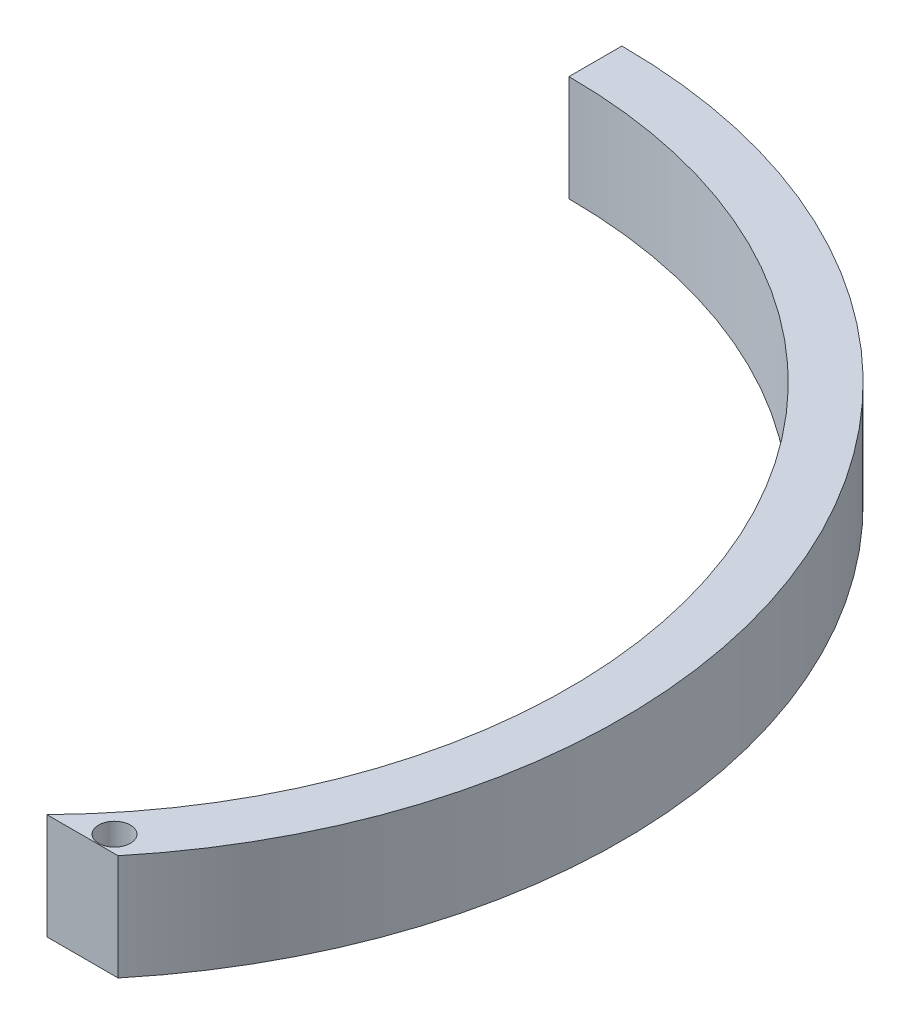
ISO-10303-21;
HEADER;
FILE_DESCRIPTION(('STEP AP214'),'2;1');
FILE_NAME('part.step','',(''),(''),'','','');
FILE_SCHEMA(('AUTOMOTIVE_DESIGN { 1 0 10303 214 1 1 1 1 }'));
ENDSEC;
DATA;
#1=APPLICATION_CONTEXT('core data for automotive mechanical design processes');
#2=APPLICATION_PROTOCOL_DEFINITION('international standard','automotive_design',2000,#1);
#3=PRODUCT_CONTEXT('',#1,'mechanical');
#4=PRODUCT('Part','Part','',(#3));
#5=PRODUCT_RELATED_PRODUCT_CATEGORY('part','',(#4));
#6=PRODUCT_DEFINITION_FORMATION('','',#4);
#7=PRODUCT_DEFINITION_CONTEXT('part definition',#1,'design');
#8=PRODUCT_DEFINITION('design','',#6,#7);
#9=PRODUCT_DEFINITION_SHAPE('','',#8);
#10=(LENGTH_UNIT() NAMED_UNIT(*) SI_UNIT(.MILLI.,.METRE.));
#11=(NAMED_UNIT(*) PLANE_ANGLE_UNIT() SI_UNIT($,.RADIAN.));
#12=(NAMED_UNIT(*) SI_UNIT($,.STERADIAN.) SOLID_ANGLE_UNIT());
#13=UNCERTAINTY_MEASURE_WITH_UNIT(LENGTH_MEASURE(1.E-05),#10,'distance_accuracy_value','');
#14=(GEOMETRIC_REPRESENTATION_CONTEXT(3) GLOBAL_UNCERTAINTY_ASSIGNED_CONTEXT((#13)) GLOBAL_UNIT_ASSIGNED_CONTEXT((#10,
#11,#12)) REPRESENTATION_CONTEXT('',''));
#15=CARTESIAN_POINT('',(0.,0.,0.));
#16=DIRECTION('',(0.,0.,1.));
#17=DIRECTION('',(1.,0.,0.));
#18=AXIS2_PLACEMENT_3D('',#15,#16,#17);
#19=CARTESIAN_POINT('',(0.,10.,0.));
#20=DIRECTION('',(0.,1.,0.));
#21=DIRECTION('',(0.,0.,1.));
#22=AXIS2_PLACEMENT_3D('',#19,#20,#21);
#23=PLANE('',#22);
#24=CARTESIAN_POINT('',(0.,10.,0.));
#25=DIRECTION('',(0.,-1.,0.));
#26=DIRECTION('',(0.,0.,1.));
#27=AXIS2_PLACEMENT_3D('',#24,#25,#26);
#28=CIRCLE('',#27,50.);
#29=CARTESIAN_POINT('',(0.,10.,-50.));
#30=VERTEX_POINT('',#29);
#31=CARTESIAN_POINT('',(35.7071421427143,10.,35.));
#32=VERTEX_POINT('',#31);
#33=EDGE_CURVE('E84',#30,#32,#28,.T.);
#34=ORIENTED_EDGE('',*,*,#33,.T.);
#35=DIRECTION('',(1.,0.,0.));
#36=VECTOR('',#35,1.);
#37=CARTESIAN_POINT('',(35.7071421427143,10.,35.));
#38=LINE('',#37,#36);
#39=CARTESIAN_POINT('',(42.4264068711929,10.,35.));
#40=VERTEX_POINT('',#39);
#41=EDGE_CURVE('E79',#32,#40,#38,.T.);
#42=ORIENTED_EDGE('',*,*,#41,.T.);
#43=CARTESIAN_POINT('',(0.,10.,0.));
#44=DIRECTION('',(0.,1.,0.));
#45=DIRECTION('',(0.,0.,1.));
#46=AXIS2_PLACEMENT_3D('',#43,#44,#45);
#47=CIRCLE('',#46,55.);
#48=CARTESIAN_POINT('',(0.,10.,-55.));
#49=VERTEX_POINT('',#48);
#50=EDGE_CURVE('E82',#40,#49,#47,.T.);
#51=ORIENTED_EDGE('',*,*,#50,.T.);
#52=DIRECTION('',(0.,0.,1.));
#53=VECTOR('',#52,1.);
#54=CARTESIAN_POINT('',(0.,10.,-50.));
#55=LINE('',#54,#53);
#56=EDGE_CURVE('E49',#49,#30,#55,.T.);
#57=ORIENTED_EDGE('',*,*,#56,.T.);
#58=EDGE_LOOP('',(#34,#42,#51,#57));
#59=FACE_BOUND('',#58,.T.);
#60=CARTESIAN_POINT('',(40.4979338315932,10.,33.4090909090909));
#61=DIRECTION('',(0.,1.,0.));
#62=DIRECTION('',(0.,0.,1.));
#63=AXIS2_PLACEMENT_3D('',#60,#61,#62);
#64=CIRCLE('',#63,1.5);
#65=CARTESIAN_POINT('',(40.4979338315932,10.,34.9090909090909));
#66=VERTEX_POINT('',#65);
#67=EDGE_CURVE('E99',#66,#66,#64,.T.);
#68=ORIENTED_EDGE('',*,*,#67,.F.);
#69=EDGE_LOOP('',(#68));
#70=FACE_BOUND('',#69,.T.);
#71=ADVANCED_FACE('F32',(#59,#70),#23,.T.);
#72=CARTESIAN_POINT('',(0.,0.,0.));
#73=DIRECTION('',(0.,1.,0.));
#74=DIRECTION('',(0.,0.,1.));
#75=AXIS2_PLACEMENT_3D('',#72,#73,#74);
#76=PLANE('',#75);
#77=CARTESIAN_POINT('',(0.,0.,0.));
#78=DIRECTION('',(0.,-1.,0.));
#79=DIRECTION('',(0.,0.,1.));
#80=AXIS2_PLACEMENT_3D('',#77,#78,#79);
#81=CIRCLE('',#80,50.);
#82=CARTESIAN_POINT('',(0.,0.,-50.));
#83=VERTEX_POINT('',#82);
#84=CARTESIAN_POINT('',(35.7071421427143,0.,35.));
#85=VERTEX_POINT('',#84);
#86=EDGE_CURVE('E96',#83,#85,#81,.T.);
#87=ORIENTED_EDGE('',*,*,#86,.F.);
#88=DIRECTION('',(0.,0.,1.));
#89=VECTOR('',#88,1.);
#90=CARTESIAN_POINT('',(0.,0.,-50.));
#91=LINE('',#90,#89);
#92=CARTESIAN_POINT('',(0.,0.,-55.));
#93=VERTEX_POINT('',#92);
#94=EDGE_CURVE('E72',#93,#83,#91,.T.);
#95=ORIENTED_EDGE('',*,*,#94,.F.);
#96=CARTESIAN_POINT('',(0.,0.,0.));
#97=DIRECTION('',(0.,1.,0.));
#98=DIRECTION('',(0.,0.,1.));
#99=AXIS2_PLACEMENT_3D('',#96,#97,#98);
#100=CIRCLE('',#99,55.);
#101=CARTESIAN_POINT('',(42.4264068711929,0.,35.));
#102=VERTEX_POINT('',#101);
#103=EDGE_CURVE('E66',#102,#93,#100,.T.);
#104=ORIENTED_EDGE('',*,*,#103,.F.);
#105=DIRECTION('',(1.,0.,0.));
#106=VECTOR('',#105,1.);
#107=CARTESIAN_POINT('',(35.7071421427143,0.,35.));
#108=LINE('',#107,#106);
#109=EDGE_CURVE('E88',#85,#102,#108,.T.);
#110=ORIENTED_EDGE('',*,*,#109,.F.);
#111=EDGE_LOOP('',(#87,#95,#104,#110));
#112=FACE_BOUND('',#111,.T.);
#113=CARTESIAN_POINT('',(40.4979338315932,0.,33.4090909090909));
#114=DIRECTION('',(0.,1.,0.));
#115=DIRECTION('',(0.,0.,1.));
#116=AXIS2_PLACEMENT_3D('',#113,#114,#115);
#117=CIRCLE('',#116,1.5);
#118=CARTESIAN_POINT('',(40.4979338315932,0.,34.9090909090909));
#119=VERTEX_POINT('',#118);
#120=EDGE_CURVE('E111',#119,#119,#117,.T.);
#121=ORIENTED_EDGE('',*,*,#120,.T.);
#122=EDGE_LOOP('',(#121));
#123=FACE_BOUND('',#122,.T.);
#124=ADVANCED_FACE('F107',(#112,#123),#76,.F.);
#125=CARTESIAN_POINT('',(0.,10.,0.));
#126=DIRECTION('',(0.,-1.,0.));
#127=DIRECTION('',(0.,0.,-1.));
#128=AXIS2_PLACEMENT_3D('',#125,#126,#127);
#129=CYLINDRICAL_SURFACE('',#128,50.);
#130=ORIENTED_EDGE('',*,*,#86,.T.);
#131=DIRECTION('',(0.,-1.,0.));
#132=VECTOR('',#131,1.);
#133=CARTESIAN_POINT('',(35.7071421427143,10.,35.));
#134=LINE('',#133,#132);
#135=EDGE_CURVE('E11',#32,#85,#134,.T.);
#136=ORIENTED_EDGE('',*,*,#135,.F.);
#137=ORIENTED_EDGE('',*,*,#33,.F.);
#138=DIRECTION('',(0.,-1.,0.));
#139=VECTOR('',#138,1.);
#140=CARTESIAN_POINT('',(0.,10.,-50.));
#141=LINE('',#140,#139);
#142=EDGE_CURVE('E92',#30,#83,#141,.T.);
#143=ORIENTED_EDGE('',*,*,#142,.T.);
#144=EDGE_LOOP('',(#130,#136,#137,#143));
#145=FACE_BOUND('',#144,.T.);
#146=ADVANCED_FACE('F34',(#145),#129,.F.);
#147=CARTESIAN_POINT('',(35.7071421427143,10.,35.));
#148=DIRECTION('',(0.,0.,-1.));
#149=DIRECTION('',(-1.,0.,0.));
#150=AXIS2_PLACEMENT_3D('',#147,#148,#149);
#151=PLANE('',#150);
#152=ORIENTED_EDGE('',*,*,#109,.T.);
#153=DIRECTION('',(0.,-1.,0.));
#154=VECTOR('',#153,1.);
#155=CARTESIAN_POINT('',(42.4264068711929,10.,35.));
#156=LINE('',#155,#154);
#157=EDGE_CURVE('E41',#40,#102,#156,.T.);
#158=ORIENTED_EDGE('',*,*,#157,.F.);
#159=ORIENTED_EDGE('',*,*,#41,.F.);
#160=ORIENTED_EDGE('',*,*,#135,.T.);
#161=EDGE_LOOP('',(#152,#158,#159,#160));
#162=FACE_BOUND('',#161,.T.);
#163=ADVANCED_FACE('F87',(#162),#151,.F.);
#164=CARTESIAN_POINT('',(0.,10.,0.));
#165=DIRECTION('',(0.,-1.,0.));
#166=DIRECTION('',(0.,0.,-1.));
#167=AXIS2_PLACEMENT_3D('',#164,#165,#166);
#168=CYLINDRICAL_SURFACE('',#167,55.);
#169=ORIENTED_EDGE('',*,*,#103,.T.);
#170=DIRECTION('',(0.,-1.,0.));
#171=VECTOR('',#170,1.);
#172=CARTESIAN_POINT('',(0.,10.,-55.));
#173=LINE('',#172,#171);
#174=EDGE_CURVE('E89',#49,#93,#173,.T.);
#175=ORIENTED_EDGE('',*,*,#174,.F.);
#176=ORIENTED_EDGE('',*,*,#50,.F.);
#177=ORIENTED_EDGE('',*,*,#157,.T.);
#178=EDGE_LOOP('',(#169,#175,#176,#177));
#179=FACE_BOUND('',#178,.T.);
#180=ADVANCED_FACE('F90',(#179),#168,.T.);
#181=CARTESIAN_POINT('',(0.,10.,-50.));
#182=DIRECTION('',(1.,0.,0.));
#183=DIRECTION('',(0.,0.,-1.));
#184=AXIS2_PLACEMENT_3D('',#181,#182,#183);
#185=PLANE('',#184);
#186=ORIENTED_EDGE('',*,*,#94,.T.);
#187=ORIENTED_EDGE('',*,*,#142,.F.);
#188=ORIENTED_EDGE('',*,*,#56,.F.);
#189=ORIENTED_EDGE('',*,*,#174,.T.);
#190=EDGE_LOOP('',(#186,#187,#188,#189));
#191=FACE_BOUND('',#190,.T.);
#192=ADVANCED_FACE('F104',(#191),#185,.F.);
#193=CARTESIAN_POINT('',(40.4979338315932,10.,33.4090909090909));
#194=DIRECTION('',(0.,-1.,0.));
#195=DIRECTION('',(0.,0.,-1.));
#196=AXIS2_PLACEMENT_3D('',#193,#194,#195);
#197=CYLINDRICAL_SURFACE('',#196,1.5);
#198=ORIENTED_EDGE('',*,*,#67,.T.);
#199=EDGE_LOOP('',(#198));
#200=FACE_BOUND('',#199,.T.);
#201=ORIENTED_EDGE('',*,*,#120,.F.);
#202=EDGE_LOOP('',(#201));
#203=FACE_BOUND('',#202,.T.);
#204=ADVANCED_FACE('F117',(#200,#203),#197,.F.);
#205=CLOSED_SHELL('',(#71,#124,#146,#163,#180,#192,#204));
#206=MANIFOLD_SOLID_BREP('B2',#205);
#207=ADVANCED_BREP_SHAPE_REPRESENTATION('',(#18,#206),#14);
#208=SHAPE_DEFINITION_REPRESENTATION(#9,#207);
ENDSEC;
END-ISO-10303-21;
